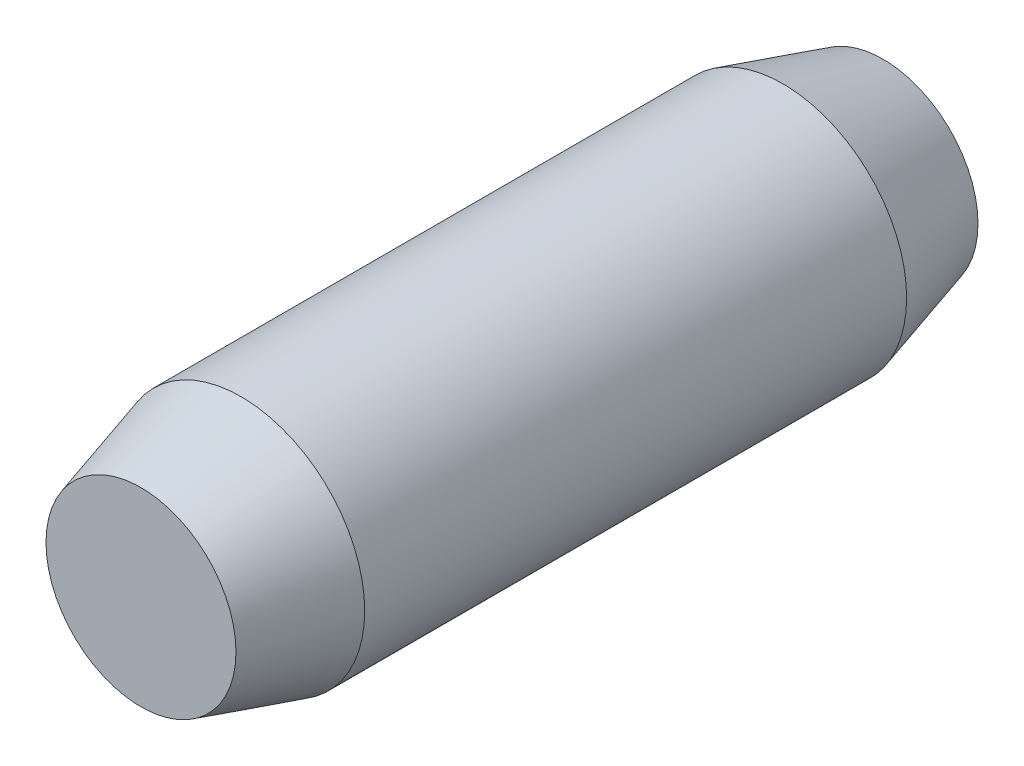
ISO-10303-21;
HEADER;
FILE_DESCRIPTION(('STEP AP214'),'2;1');
FILE_NAME('part.step','',(''),(''),'','','');
FILE_SCHEMA(('AUTOMOTIVE_DESIGN { 1 0 10303 214 1 1 1 1 }'));
ENDSEC;
DATA;
#1=APPLICATION_CONTEXT('core data for automotive mechanical design processes');
#2=APPLICATION_PROTOCOL_DEFINITION('international standard','automotive_design',2000,#1);
#3=PRODUCT_CONTEXT('',#1,'mechanical');
#4=PRODUCT('Part','Part','',(#3));
#5=PRODUCT_RELATED_PRODUCT_CATEGORY('part','',(#4));
#6=PRODUCT_DEFINITION_FORMATION('','',#4);
#7=PRODUCT_DEFINITION_CONTEXT('part definition',#1,'design');
#8=PRODUCT_DEFINITION('design','',#6,#7);
#9=PRODUCT_DEFINITION_SHAPE('','',#8);
#10=(LENGTH_UNIT() NAMED_UNIT(*) SI_UNIT(.MILLI.,.METRE.));
#11=(NAMED_UNIT(*) PLANE_ANGLE_UNIT() SI_UNIT($,.RADIAN.));
#12=(NAMED_UNIT(*) SI_UNIT($,.STERADIAN.) SOLID_ANGLE_UNIT());
#13=UNCERTAINTY_MEASURE_WITH_UNIT(LENGTH_MEASURE(1.E-05),#10,'distance_accuracy_value','');
#14=(GEOMETRIC_REPRESENTATION_CONTEXT(3) GLOBAL_UNCERTAINTY_ASSIGNED_CONTEXT((#13)) GLOBAL_UNIT_ASSIGNED_CONTEXT((#10,
#11,#12)) REPRESENTATION_CONTEXT('',''));
#15=CARTESIAN_POINT('',(0.,0.,0.));
#16=DIRECTION('',(0.,0.,1.));
#17=DIRECTION('',(1.,0.,0.));
#18=AXIS2_PLACEMENT_3D('',#15,#16,#17);
#19=CARTESIAN_POINT('',(0.,0.,2.38125));
#20=DIRECTION('',(0.,0.,-1.));
#21=DIRECTION('',(-1.,0.,0.));
#22=AXIS2_PLACEMENT_3D('',#19,#20,#21);
#23=PLANE('',#22);
#24=CARTESIAN_POINT('',(0.,0.,2.38125));
#25=DIRECTION('',(0.,0.,1.));
#26=DIRECTION('',(1.,0.,0.));
#27=AXIS2_PLACEMENT_3D('',#24,#25,#26);
#28=CIRCLE('',#27,0.6096);
#29=CARTESIAN_POINT('',(0.6096,0.,2.38125));
#30=VERTEX_POINT('',#29);
#31=EDGE_CURVE('E10',#30,#30,#28,.T.);
#32=ORIENTED_EDGE('',*,*,#31,.T.);
#33=EDGE_LOOP('',(#32));
#34=FACE_BOUND('',#33,.T.);
#35=ADVANCED_FACE('F32',(#34),#23,.F.);
#36=CARTESIAN_POINT('',(0.,0.,1.73904263016671));
#37=DIRECTION('',(0.,0.,-1.));
#38=DIRECTION('',(-1.,0.,0.));
#39=AXIS2_PLACEMENT_3D('',#36,#37,#38);
#40=CONICAL_SURFACE('',#39,0.793749999999999,0.279252680319095);
#41=ORIENTED_EDGE('',*,*,#31,.F.);
#42=EDGE_LOOP('',(#41));
#43=FACE_BOUND('',#42,.T.);
#44=CARTESIAN_POINT('',(0.,0.,1.73904263016671));
#45=DIRECTION('',(0.,0.,1.));
#46=DIRECTION('',(1.,0.,0.));
#47=AXIS2_PLACEMENT_3D('',#44,#45,#46);
#48=CIRCLE('',#47,0.793749999999999);
#49=CARTESIAN_POINT('',(0.793749999999999,0.,1.73904263016671));
#50=VERTEX_POINT('',#49);
#51=EDGE_CURVE('E38',#50,#50,#48,.T.);
#52=ORIENTED_EDGE('',*,*,#51,.T.);
#53=EDGE_LOOP('',(#52));
#54=FACE_BOUND('',#53,.T.);
#55=ADVANCED_FACE('F64',(#43,#54),#40,.T.);
#56=CARTESIAN_POINT('',(0.,0.,2.38125));
#57=DIRECTION('',(0.,0.,1.));
#58=DIRECTION('',(1.,0.,0.));
#59=AXIS2_PLACEMENT_3D('',#56,#57,#58);
#60=CYLINDRICAL_SURFACE('',#59,0.793749999999999);
#61=ORIENTED_EDGE('',*,*,#51,.F.);
#62=EDGE_LOOP('',(#61));
#63=FACE_BOUND('',#62,.T.);
#64=CARTESIAN_POINT('',(0.,0.,-1.73904263016671));
#65=DIRECTION('',(0.,0.,1.));
#66=DIRECTION('',(1.,0.,0.));
#67=AXIS2_PLACEMENT_3D('',#64,#65,#66);
#68=CIRCLE('',#67,0.793749999999999);
#69=CARTESIAN_POINT('',(0.793749999999999,0.,-1.73904263016671));
#70=VERTEX_POINT('',#69);
#71=EDGE_CURVE('E42',#70,#70,#68,.T.);
#72=ORIENTED_EDGE('',*,*,#71,.T.);
#73=EDGE_LOOP('',(#72));
#74=FACE_BOUND('',#73,.T.);
#75=ADVANCED_FACE('F60',(#63,#74),#60,.T.);
#76=CARTESIAN_POINT('',(0.,0.,-2.38125));
#77=DIRECTION('',(0.,0.,1.));
#78=DIRECTION('',(1.,0.,0.));
#79=AXIS2_PLACEMENT_3D('',#76,#77,#78);
#80=CONICAL_SURFACE('',#79,0.6096,0.279252680319095);
#81=ORIENTED_EDGE('',*,*,#71,.F.);
#82=EDGE_LOOP('',(#81));
#83=FACE_BOUND('',#82,.T.);
#84=CARTESIAN_POINT('',(0.,0.,-2.38125));
#85=DIRECTION('',(0.,0.,1.));
#86=DIRECTION('',(1.,0.,0.));
#87=AXIS2_PLACEMENT_3D('',#84,#85,#86);
#88=CIRCLE('',#87,0.6096);
#89=CARTESIAN_POINT('',(0.6096,0.,-2.38125));
#90=VERTEX_POINT('',#89);
#91=EDGE_CURVE('E46',#90,#90,#88,.T.);
#92=ORIENTED_EDGE('',*,*,#91,.T.);
#93=EDGE_LOOP('',(#92));
#94=FACE_BOUND('',#93,.T.);
#95=ADVANCED_FACE('F52',(#83,#94),#80,.T.);
#96=CARTESIAN_POINT('',(0.,0.6096,-2.38125));
#97=DIRECTION('',(0.,0.,1.));
#98=DIRECTION('',(1.,0.,0.));
#99=AXIS2_PLACEMENT_3D('',#96,#97,#98);
#100=PLANE('',#99);
#101=ORIENTED_EDGE('',*,*,#91,.F.);
#102=EDGE_LOOP('',(#101));
#103=FACE_BOUND('',#102,.T.);
#104=ADVANCED_FACE('F54',(#103),#100,.F.);
#105=CLOSED_SHELL('',(#35,#55,#75,#95,#104));
#106=MANIFOLD_SOLID_BREP('B2',#105);
#107=ADVANCED_BREP_SHAPE_REPRESENTATION('',(#18,#106),#14);
#108=SHAPE_DEFINITION_REPRESENTATION(#9,#107);
ENDSEC;
END-ISO-10303-21;
